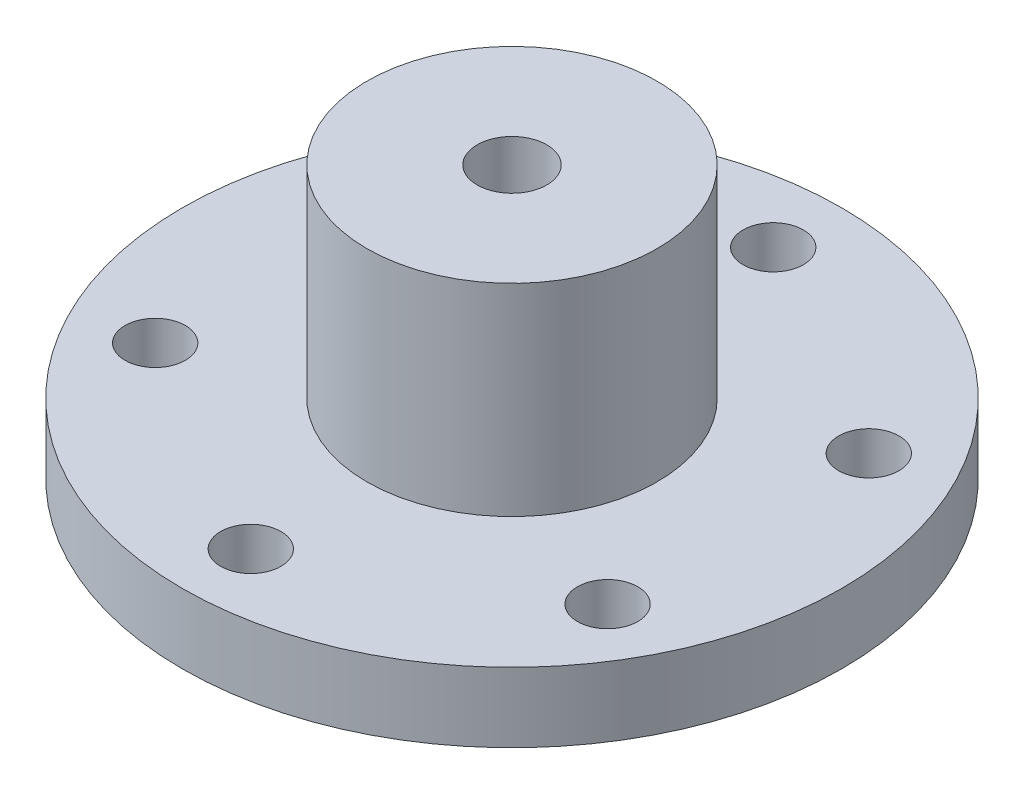
ISO-10303-21;
HEADER;
FILE_DESCRIPTION(('STEP AP214'),'2;1');
FILE_NAME('part.step','',(''),(''),'','','');
FILE_SCHEMA(('AUTOMOTIVE_DESIGN { 1 0 10303 214 1 1 1 1 }'));
ENDSEC;
DATA;
#1=APPLICATION_CONTEXT('core data for automotive mechanical design processes');
#2=APPLICATION_PROTOCOL_DEFINITION('international standard','automotive_design',2000,#1);
#3=PRODUCT_CONTEXT('',#1,'mechanical');
#4=PRODUCT('Part','Part','',(#3));
#5=PRODUCT_RELATED_PRODUCT_CATEGORY('part','',(#4));
#6=PRODUCT_DEFINITION_FORMATION('','',#4);
#7=PRODUCT_DEFINITION_CONTEXT('part definition',#1,'design');
#8=PRODUCT_DEFINITION('design','',#6,#7);
#9=PRODUCT_DEFINITION_SHAPE('','',#8);
#10=(LENGTH_UNIT() NAMED_UNIT(*) SI_UNIT(.MILLI.,.METRE.));
#11=(NAMED_UNIT(*) PLANE_ANGLE_UNIT() SI_UNIT($,.RADIAN.));
#12=(NAMED_UNIT(*) SI_UNIT($,.STERADIAN.) SOLID_ANGLE_UNIT());
#13=UNCERTAINTY_MEASURE_WITH_UNIT(LENGTH_MEASURE(1.E-05),#10,'distance_accuracy_value','');
#14=(GEOMETRIC_REPRESENTATION_CONTEXT(3) GLOBAL_UNCERTAINTY_ASSIGNED_CONTEXT((#13)) GLOBAL_UNIT_ASSIGNED_CONTEXT((#10,
#11,#12)) REPRESENTATION_CONTEXT('',''));
#15=CARTESIAN_POINT('',(0.,0.,0.));
#16=DIRECTION('',(0.,0.,1.));
#17=DIRECTION('',(1.,0.,0.));
#18=AXIS2_PLACEMENT_3D('',#15,#16,#17);
#19=CARTESIAN_POINT('',(0.,6.,0.));
#20=DIRECTION('',(0.,-1.,0.));
#21=DIRECTION('',(0.,0.,-1.));
#22=AXIS2_PLACEMENT_3D('',#19,#20,#21);
#23=CYLINDRICAL_SURFACE('',#22,28.4);
#24=CARTESIAN_POINT('',(0.,6.,0.));
#25=DIRECTION('',(0.,1.,0.));
#26=DIRECTION('',(0.,0.,1.));
#27=AXIS2_PLACEMENT_3D('',#24,#25,#26);
#28=CIRCLE('',#27,28.4);
#29=CARTESIAN_POINT('',(0.,6.,28.4));
#30=VERTEX_POINT('',#29);
#31=EDGE_CURVE('E44',#30,#30,#28,.T.);
#32=ORIENTED_EDGE('',*,*,#31,.F.);
#33=EDGE_LOOP('',(#32));
#34=FACE_BOUND('',#33,.T.);
#35=CARTESIAN_POINT('',(0.,0.,0.));
#36=DIRECTION('',(0.,1.,0.));
#37=DIRECTION('',(0.,0.,1.));
#38=AXIS2_PLACEMENT_3D('',#35,#36,#37);
#39=CIRCLE('',#38,28.4);
#40=CARTESIAN_POINT('',(0.,0.,28.4));
#41=VERTEX_POINT('',#40);
#42=EDGE_CURVE('E40',#41,#41,#39,.T.);
#43=ORIENTED_EDGE('',*,*,#42,.T.);
#44=EDGE_LOOP('',(#43));
#45=FACE_BOUND('',#44,.T.);
#46=ADVANCED_FACE('F37',(#34,#45),#23,.T.);
#47=CARTESIAN_POINT('',(0.,6.,0.));
#48=DIRECTION('',(0.,1.,0.));
#49=DIRECTION('',(0.,0.,1.));
#50=AXIS2_PLACEMENT_3D('',#47,#48,#49);
#51=PLANE('',#50);
#52=CARTESIAN_POINT('',(0.,6.,22.5));
#53=DIRECTION('',(0.,1.,0.));
#54=DIRECTION('',(0.,0.,1.));
#55=AXIS2_PLACEMENT_3D('',#52,#53,#54);
#56=CIRCLE('',#55,2.6);
#57=CARTESIAN_POINT('',(0.,6.,25.1));
#58=VERTEX_POINT('',#57);
#59=EDGE_CURVE('E59',#58,#58,#56,.T.);
#60=ORIENTED_EDGE('',*,*,#59,.F.);
#61=EDGE_LOOP('',(#60));
#62=FACE_BOUND('',#61,.T.);
#63=CARTESIAN_POINT('',(-19.4855715851497,6.,11.2500000000002));
#64=DIRECTION('',(0.,1.,0.));
#65=DIRECTION('',(0.,0.,1.));
#66=AXIS2_PLACEMENT_3D('',#63,#64,#65);
#67=CIRCLE('',#66,2.6);
#68=CARTESIAN_POINT('',(-19.4855715851497,6.,13.8500000000002));
#69=VERTEX_POINT('',#68);
#70=EDGE_CURVE('E62',#69,#69,#67,.T.);
#71=ORIENTED_EDGE('',*,*,#70,.F.);
#72=EDGE_LOOP('',(#71));
#73=FACE_BOUND('',#72,.T.);
#74=CARTESIAN_POINT('',(-19.48557158515,6.,-11.2499999999998));
#75=DIRECTION('',(0.,1.,0.));
#76=DIRECTION('',(0.,0.,1.));
#77=AXIS2_PLACEMENT_3D('',#74,#75,#76);
#78=CIRCLE('',#77,2.6);
#79=CARTESIAN_POINT('',(-19.48557158515,6.,-8.64999999999982));
#80=VERTEX_POINT('',#79);
#81=EDGE_CURVE('E65',#80,#80,#78,.T.);
#82=ORIENTED_EDGE('',*,*,#81,.F.);
#83=EDGE_LOOP('',(#82));
#84=FACE_BOUND('',#83,.T.);
#85=CARTESIAN_POINT('',(-1.57116660247941E-13,6.,-22.5));
#86=DIRECTION('',(0.,1.,0.));
#87=DIRECTION('',(0.,0.,1.));
#88=AXIS2_PLACEMENT_3D('',#85,#86,#87);
#89=CIRCLE('',#88,2.6);
#90=CARTESIAN_POINT('',(-1.57116660247941E-13,6.,-19.9));
#91=VERTEX_POINT('',#90);
#92=EDGE_CURVE('E68',#91,#91,#89,.T.);
#93=ORIENTED_EDGE('',*,*,#92,.F.);
#94=EDGE_LOOP('',(#93));
#95=FACE_BOUND('',#94,.T.);
#96=CARTESIAN_POINT('',(19.4855715851498,6.,-11.2500000000001));
#97=DIRECTION('',(0.,1.,0.));
#98=DIRECTION('',(0.,0.,1.));
#99=AXIS2_PLACEMENT_3D('',#96,#97,#98);
#100=CIRCLE('',#99,2.6);
#101=CARTESIAN_POINT('',(19.4855715851498,6.,-8.65000000000009));
#102=VERTEX_POINT('',#101);
#103=EDGE_CURVE('E71',#102,#102,#100,.T.);
#104=ORIENTED_EDGE('',*,*,#103,.F.);
#105=EDGE_LOOP('',(#104));
#106=FACE_BOUND('',#105,.T.);
#107=CARTESIAN_POINT('',(19.4855715851499,6.,11.25));
#108=DIRECTION('',(0.,1.,0.));
#109=DIRECTION('',(0.,0.,1.));
#110=AXIS2_PLACEMENT_3D('',#107,#108,#109);
#111=CIRCLE('',#110,2.6);
#112=CARTESIAN_POINT('',(19.4855715851499,6.,13.85));
#113=VERTEX_POINT('',#112);
#114=EDGE_CURVE('E74',#113,#113,#111,.T.);
#115=ORIENTED_EDGE('',*,*,#114,.F.);
#116=EDGE_LOOP('',(#115));
#117=FACE_BOUND('',#116,.T.);
#118=CARTESIAN_POINT('',(0.,6.,0.));
#119=DIRECTION('',(0.,1.,0.));
#120=DIRECTION('',(0.,0.,1.));
#121=AXIS2_PLACEMENT_3D('',#118,#119,#120);
#122=CIRCLE('',#121,12.5);
#123=CARTESIAN_POINT('',(0.,6.,12.5));
#124=VERTEX_POINT('',#123);
#125=EDGE_CURVE('E10',#124,#124,#122,.T.);
#126=ORIENTED_EDGE('',*,*,#125,.F.);
#127=EDGE_LOOP('',(#126));
#128=FACE_BOUND('',#127,.T.);
#129=ORIENTED_EDGE('',*,*,#31,.T.);
#130=EDGE_LOOP('',(#129));
#131=FACE_BOUND('',#130,.T.);
#132=ADVANCED_FACE('F102',(#62,#73,#84,#95,#106,#117,#128,#131),#51,.T.);
#133=CARTESIAN_POINT('',(0.,0.,0.));
#134=DIRECTION('',(0.,1.,0.));
#135=DIRECTION('',(0.,0.,1.));
#136=AXIS2_PLACEMENT_3D('',#133,#134,#135);
#137=PLANE('',#136);
#138=CARTESIAN_POINT('',(0.,0.,22.5));
#139=DIRECTION('',(0.,-1.,0.));
#140=DIRECTION('',(0.,0.,-1.));
#141=AXIS2_PLACEMENT_3D('',#138,#139,#140);
#142=CIRCLE('',#141,2.6);
#143=CARTESIAN_POINT('',(0.,0.,19.9));
#144=VERTEX_POINT('',#143);
#145=EDGE_CURVE('E77',#144,#144,#142,.T.);
#146=ORIENTED_EDGE('',*,*,#145,.F.);
#147=EDGE_LOOP('',(#146));
#148=FACE_BOUND('',#147,.T.);
#149=CARTESIAN_POINT('',(-19.4855715851497,0.,11.2500000000002));
#150=DIRECTION('',(0.,-1.,0.));
#151=DIRECTION('',(0.,0.,-1.));
#152=AXIS2_PLACEMENT_3D('',#149,#150,#151);
#153=CIRCLE('',#152,2.6);
#154=CARTESIAN_POINT('',(-19.4855715851497,0.,8.65000000000023));
#155=VERTEX_POINT('',#154);
#156=EDGE_CURVE('E82',#155,#155,#153,.T.);
#157=ORIENTED_EDGE('',*,*,#156,.F.);
#158=EDGE_LOOP('',(#157));
#159=FACE_BOUND('',#158,.T.);
#160=CARTESIAN_POINT('',(-19.48557158515,0.,-11.2499999999998));
#161=DIRECTION('',(0.,-1.,0.));
#162=DIRECTION('',(0.,0.,-1.));
#163=AXIS2_PLACEMENT_3D('',#160,#161,#162);
#164=CIRCLE('',#163,2.6);
#165=CARTESIAN_POINT('',(-19.48557158515,0.,-13.8499999999998));
#166=VERTEX_POINT('',#165);
#167=EDGE_CURVE('E78',#166,#166,#164,.T.);
#168=ORIENTED_EDGE('',*,*,#167,.F.);
#169=EDGE_LOOP('',(#168));
#170=FACE_BOUND('',#169,.T.);
#171=CARTESIAN_POINT('',(-1.57116660247941E-13,0.,-22.5));
#172=DIRECTION('',(0.,-1.,0.));
#173=DIRECTION('',(0.,0.,-1.));
#174=AXIS2_PLACEMENT_3D('',#171,#172,#173);
#175=CIRCLE('',#174,2.6);
#176=CARTESIAN_POINT('',(-1.57116660247941E-13,0.,-25.1));
#177=VERTEX_POINT('',#176);
#178=EDGE_CURVE('E81',#177,#177,#175,.T.);
#179=ORIENTED_EDGE('',*,*,#178,.F.);
#180=EDGE_LOOP('',(#179));
#181=FACE_BOUND('',#180,.T.);
#182=CARTESIAN_POINT('',(19.4855715851498,0.,-11.2500000000001));
#183=DIRECTION('',(0.,-1.,0.));
#184=DIRECTION('',(0.,0.,-1.));
#185=AXIS2_PLACEMENT_3D('',#182,#183,#184);
#186=CIRCLE('',#185,2.6);
#187=CARTESIAN_POINT('',(19.4855715851498,0.,-13.8500000000001));
#188=VERTEX_POINT('',#187);
#189=EDGE_CURVE('E85',#188,#188,#186,.T.);
#190=ORIENTED_EDGE('',*,*,#189,.F.);
#191=EDGE_LOOP('',(#190));
#192=FACE_BOUND('',#191,.T.);
#193=CARTESIAN_POINT('',(19.4855715851499,0.,11.25));
#194=DIRECTION('',(0.,-1.,0.));
#195=DIRECTION('',(0.,0.,-1.));
#196=AXIS2_PLACEMENT_3D('',#193,#194,#195);
#197=CIRCLE('',#196,2.6);
#198=CARTESIAN_POINT('',(19.4855715851499,0.,8.64999999999996));
#199=VERTEX_POINT('',#198);
#200=EDGE_CURVE('E88',#199,#199,#197,.T.);
#201=ORIENTED_EDGE('',*,*,#200,.F.);
#202=EDGE_LOOP('',(#201));
#203=FACE_BOUND('',#202,.T.);
#204=CARTESIAN_POINT('',(0.,0.,0.));
#205=DIRECTION('',(0.,1.,0.));
#206=DIRECTION('',(0.,0.,1.));
#207=AXIS2_PLACEMENT_3D('',#204,#205,#206);
#208=CIRCLE('',#207,3.);
#209=CARTESIAN_POINT('',(0.,0.,3.));
#210=VERTEX_POINT('',#209);
#211=EDGE_CURVE('E53',#210,#210,#208,.T.);
#212=ORIENTED_EDGE('',*,*,#211,.T.);
#213=EDGE_LOOP('',(#212));
#214=FACE_BOUND('',#213,.T.);
#215=ORIENTED_EDGE('',*,*,#42,.F.);
#216=EDGE_LOOP('',(#215));
#217=FACE_BOUND('',#216,.T.);
#218=ADVANCED_FACE('F98',(#148,#159,#170,#181,#192,#203,#214,#217),#137,.F.);
#219=CARTESIAN_POINT('',(0.,23.4,0.));
#220=DIRECTION('',(0.,-1.,0.));
#221=DIRECTION('',(0.,0.,-1.));
#222=AXIS2_PLACEMENT_3D('',#219,#220,#221);
#223=CYLINDRICAL_SURFACE('',#222,12.5);
#224=CARTESIAN_POINT('',(0.,23.4,0.));
#225=DIRECTION('',(0.,1.,0.));
#226=DIRECTION('',(0.,0.,1.));
#227=AXIS2_PLACEMENT_3D('',#224,#225,#226);
#228=CIRCLE('',#227,12.5);
#229=CARTESIAN_POINT('',(0.,23.4,12.5));
#230=VERTEX_POINT('',#229);
#231=EDGE_CURVE('E50',#230,#230,#228,.T.);
#232=ORIENTED_EDGE('',*,*,#231,.F.);
#233=EDGE_LOOP('',(#232));
#234=FACE_BOUND('',#233,.T.);
#235=ORIENTED_EDGE('',*,*,#125,.T.);
#236=EDGE_LOOP('',(#235));
#237=FACE_BOUND('',#236,.T.);
#238=ADVANCED_FACE('F101',(#234,#237),#223,.T.);
#239=CARTESIAN_POINT('',(0.,23.4,0.));
#240=DIRECTION('',(0.,1.,0.));
#241=DIRECTION('',(0.,0.,1.));
#242=AXIS2_PLACEMENT_3D('',#239,#240,#241);
#243=PLANE('',#242);
#244=CARTESIAN_POINT('',(0.,23.4,0.));
#245=DIRECTION('',(0.,1.,0.));
#246=DIRECTION('',(0.,0.,1.));
#247=AXIS2_PLACEMENT_3D('',#244,#245,#246);
#248=CIRCLE('',#247,3.);
#249=CARTESIAN_POINT('',(0.,23.4,3.));
#250=VERTEX_POINT('',#249);
#251=EDGE_CURVE('E56',#250,#250,#248,.T.);
#252=ORIENTED_EDGE('',*,*,#251,.F.);
#253=EDGE_LOOP('',(#252));
#254=FACE_BOUND('',#253,.T.);
#255=ORIENTED_EDGE('',*,*,#231,.T.);
#256=EDGE_LOOP('',(#255));
#257=FACE_BOUND('',#256,.T.);
#258=ADVANCED_FACE('F134',(#254,#257),#243,.T.);
#259=CARTESIAN_POINT('',(0.,-36.6,0.));
#260=DIRECTION('',(0.,1.,0.));
#261=DIRECTION('',(0.,0.,1.));
#262=AXIS2_PLACEMENT_3D('',#259,#260,#261);
#263=CYLINDRICAL_SURFACE('',#262,3.);
#264=ORIENTED_EDGE('',*,*,#251,.T.);
#265=EDGE_LOOP('',(#264));
#266=FACE_BOUND('',#265,.T.);
#267=ORIENTED_EDGE('',*,*,#211,.F.);
#268=EDGE_LOOP('',(#267));
#269=FACE_BOUND('',#268,.T.);
#270=ADVANCED_FACE('F138',(#266,#269),#263,.F.);
#271=CARTESIAN_POINT('',(19.4855715851499,10.,11.25));
#272=DIRECTION('',(0.,-1.,0.));
#273=DIRECTION('',(0.,0.,-1.));
#274=AXIS2_PLACEMENT_3D('',#271,#272,#273);
#275=CYLINDRICAL_SURFACE('',#274,2.6);
#276=ORIENTED_EDGE('',*,*,#114,.T.);
#277=EDGE_LOOP('',(#276));
#278=FACE_BOUND('',#277,.T.);
#279=ORIENTED_EDGE('',*,*,#200,.T.);
#280=EDGE_LOOP('',(#279));
#281=FACE_BOUND('',#280,.T.);
#282=ADVANCED_FACE('F142',(#278,#281),#275,.F.);
#283=CARTESIAN_POINT('',(19.4855715851498,10.,-11.2500000000001));
#284=DIRECTION('',(0.,-1.,0.));
#285=DIRECTION('',(0.,0.,-1.));
#286=AXIS2_PLACEMENT_3D('',#283,#284,#285);
#287=CYLINDRICAL_SURFACE('',#286,2.6);
#288=ORIENTED_EDGE('',*,*,#103,.T.);
#289=EDGE_LOOP('',(#288));
#290=FACE_BOUND('',#289,.T.);
#291=ORIENTED_EDGE('',*,*,#189,.T.);
#292=EDGE_LOOP('',(#291));
#293=FACE_BOUND('',#292,.T.);
#294=ADVANCED_FACE('F152',(#290,#293),#287,.F.);
#295=CARTESIAN_POINT('',(-1.57116660247941E-13,10.,-22.5));
#296=DIRECTION('',(0.,-1.,0.));
#297=DIRECTION('',(0.,0.,-1.));
#298=AXIS2_PLACEMENT_3D('',#295,#296,#297);
#299=CYLINDRICAL_SURFACE('',#298,2.6);
#300=ORIENTED_EDGE('',*,*,#92,.T.);
#301=EDGE_LOOP('',(#300));
#302=FACE_BOUND('',#301,.T.);
#303=ORIENTED_EDGE('',*,*,#178,.T.);
#304=EDGE_LOOP('',(#303));
#305=FACE_BOUND('',#304,.T.);
#306=ADVANCED_FACE('F148',(#302,#305),#299,.F.);
#307=CARTESIAN_POINT('',(-19.48557158515,10.,-11.2499999999998));
#308=DIRECTION('',(0.,-1.,0.));
#309=DIRECTION('',(0.,0.,-1.));
#310=AXIS2_PLACEMENT_3D('',#307,#308,#309);
#311=CYLINDRICAL_SURFACE('',#310,2.6);
#312=ORIENTED_EDGE('',*,*,#81,.T.);
#313=EDGE_LOOP('',(#312));
#314=FACE_BOUND('',#313,.T.);
#315=ORIENTED_EDGE('',*,*,#167,.T.);
#316=EDGE_LOOP('',(#315));
#317=FACE_BOUND('',#316,.T.);
#318=ADVANCED_FACE('F144',(#314,#317),#311,.F.);
#319=CARTESIAN_POINT('',(-19.4855715851497,10.,11.2500000000002));
#320=DIRECTION('',(0.,-1.,0.));
#321=DIRECTION('',(0.,0.,-1.));
#322=AXIS2_PLACEMENT_3D('',#319,#320,#321);
#323=CYLINDRICAL_SURFACE('',#322,2.6);
#324=ORIENTED_EDGE('',*,*,#70,.T.);
#325=EDGE_LOOP('',(#324));
#326=FACE_BOUND('',#325,.T.);
#327=ORIENTED_EDGE('',*,*,#156,.T.);
#328=EDGE_LOOP('',(#327));
#329=FACE_BOUND('',#328,.T.);
#330=ADVANCED_FACE('F147',(#326,#329),#323,.F.);
#331=CARTESIAN_POINT('',(0.,10.,22.5));
#332=DIRECTION('',(0.,-1.,0.));
#333=DIRECTION('',(0.,0.,-1.));
#334=AXIS2_PLACEMENT_3D('',#331,#332,#333);
#335=CYLINDRICAL_SURFACE('',#334,2.6);
#336=ORIENTED_EDGE('',*,*,#59,.T.);
#337=EDGE_LOOP('',(#336));
#338=FACE_BOUND('',#337,.T.);
#339=ORIENTED_EDGE('',*,*,#145,.T.);
#340=EDGE_LOOP('',(#339));
#341=FACE_BOUND('',#340,.T.);
#342=ADVANCED_FACE('F96',(#338,#341),#335,.F.);
#343=CLOSED_SHELL('',(#46,#132,#218,#238,#258,#270,#282,#294,#306,#318,#330,#342));
#344=MANIFOLD_SOLID_BREP('B2',#343);
#345=ADVANCED_BREP_SHAPE_REPRESENTATION('',(#18,#344),#14);
#346=SHAPE_DEFINITION_REPRESENTATION(#9,#345);
ENDSEC;
END-ISO-10303-21;
